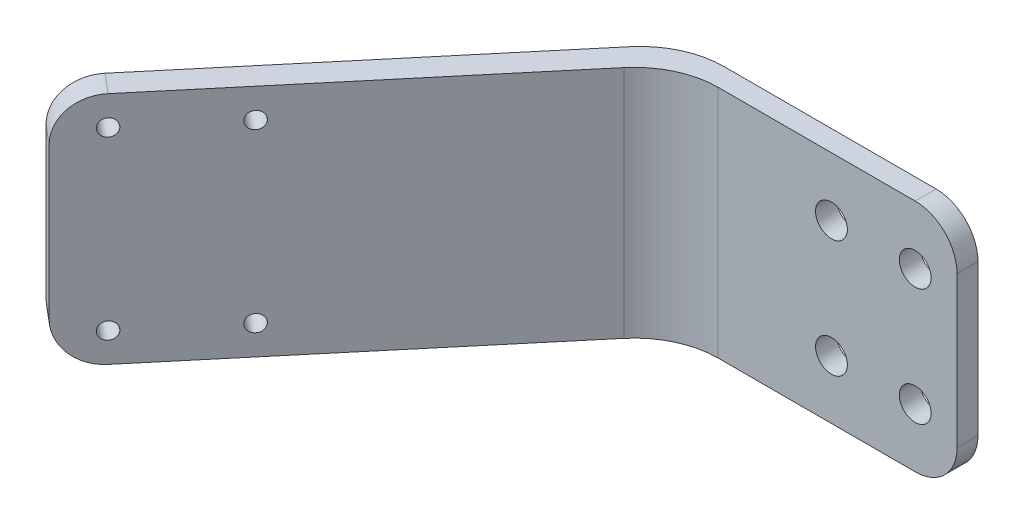
ISO-10303-21;
HEADER;
FILE_DESCRIPTION(('STEP AP214'),'2;1');
FILE_NAME('part.step','',(''),(''),'','','');
FILE_SCHEMA(('AUTOMOTIVE_DESIGN { 1 0 10303 214 1 1 1 1 }'));
ENDSEC;
DATA;
#1=APPLICATION_CONTEXT('core data for automotive mechanical design processes');
#2=APPLICATION_PROTOCOL_DEFINITION('international standard','automotive_design',2000,#1);
#3=PRODUCT_CONTEXT('',#1,'mechanical');
#4=PRODUCT('Part','Part','',(#3));
#5=PRODUCT_RELATED_PRODUCT_CATEGORY('part','',(#4));
#6=PRODUCT_DEFINITION_FORMATION('','',#4);
#7=PRODUCT_DEFINITION_CONTEXT('part definition',#1,'design');
#8=PRODUCT_DEFINITION('design','',#6,#7);
#9=PRODUCT_DEFINITION_SHAPE('','',#8);
#10=(LENGTH_UNIT() NAMED_UNIT(*) SI_UNIT(.MILLI.,.METRE.));
#11=(NAMED_UNIT(*) PLANE_ANGLE_UNIT() SI_UNIT($,.RADIAN.));
#12=(NAMED_UNIT(*) SI_UNIT($,.STERADIAN.) SOLID_ANGLE_UNIT());
#13=UNCERTAINTY_MEASURE_WITH_UNIT(LENGTH_MEASURE(1.E-05),#10,'distance_accuracy_value','');
#14=(GEOMETRIC_REPRESENTATION_CONTEXT(3) GLOBAL_UNCERTAINTY_ASSIGNED_CONTEXT((#13)) GLOBAL_UNIT_ASSIGNED_CONTEXT((#10,
#11,#12)) REPRESENTATION_CONTEXT('',''));
#15=CARTESIAN_POINT('',(0.,0.,0.));
#16=DIRECTION('',(0.,0.,1.));
#17=DIRECTION('',(1.,0.,0.));
#18=AXIS2_PLACEMENT_3D('',#15,#16,#17);
#19=CARTESIAN_POINT('',(0.,0.,-2.5));
#20=DIRECTION('',(0.,0.,1.));
#21=DIRECTION('',(1.,0.,0.));
#22=AXIS2_PLACEMENT_3D('',#19,#20,#21);
#23=PLANE('',#22);
#24=CARTESIAN_POINT('',(-158.168511731156,42.1549400479616,-2.5));
#25=DIRECTION('',(0.,0.,1.));
#26=DIRECTION('',(1.,0.,0.));
#27=AXIS2_PLACEMENT_3D('',#24,#25,#26);
#28=CIRCLE('',#27,1.89999999999997);
#29=CARTESIAN_POINT('',(-156.268511731156,42.1549400479616,-2.5));
#30=VERTEX_POINT('',#29);
#31=EDGE_CURVE('E353',#30,#30,#28,.T.);
#32=ORIENTED_EDGE('',*,*,#31,.T.);
#33=EDGE_LOOP('',(#32));
#34=FACE_BOUND('',#33,.T.);
#35=CARTESIAN_POINT('',(-148.168511731156,56.1549400479616,-2.5));
#36=DIRECTION('',(0.,0.,1.));
#37=DIRECTION('',(1.,0.,0.));
#38=AXIS2_PLACEMENT_3D('',#35,#36,#37);
#39=CIRCLE('',#38,1.9);
#40=CARTESIAN_POINT('',(-146.268511731156,56.1549400479616,-2.5));
#41=VERTEX_POINT('',#40);
#42=EDGE_CURVE('E347',#41,#41,#39,.T.);
#43=ORIENTED_EDGE('',*,*,#42,.T.);
#44=EDGE_LOOP('',(#43));
#45=FACE_BOUND('',#44,.T.);
#46=DIRECTION('',(0.,1.,0.));
#47=VECTOR('',#46,1.);
#48=CARTESIAN_POINT('',(-143.168511731156,63.1549400479616,-2.5));
#49=LINE('',#48,#47);
#50=CARTESIAN_POINT('',(-143.168511731156,40.1549400479616,-2.5));
#51=VERTEX_POINT('',#50);
#52=CARTESIAN_POINT('',(-143.168511731156,58.1549400479616,-2.5));
#53=VERTEX_POINT('',#52);
#54=EDGE_CURVE('E220',#51,#53,#49,.T.);
#55=ORIENTED_EDGE('',*,*,#54,.F.);
#56=CARTESIAN_POINT('',(-148.168511731156,40.1549400479616,-2.5));
#57=DIRECTION('',(0.,0.,1.));
#58=DIRECTION('',(1.,0.,0.));
#59=AXIS2_PLACEMENT_3D('',#56,#57,#58);
#60=CIRCLE('',#59,5.);
#61=CARTESIAN_POINT('',(-148.168511731156,35.1549400479616,-2.5));
#62=VERTEX_POINT('',#61);
#63=EDGE_CURVE('E182',#51,#62,#60,.F.);
#64=ORIENTED_EDGE('',*,*,#63,.T.);
#65=DIRECTION('',(1.,0.,0.));
#66=VECTOR('',#65,1.);
#67=CARTESIAN_POINT('',(-178.168511731156,35.1549400479616,-2.5));
#68=LINE('',#67,#66);
#69=CARTESIAN_POINT('',(-173.505435149606,35.1549400479616,-2.5));
#70=VERTEX_POINT('',#69);
#71=EDGE_CURVE('E146',#70,#62,#68,.T.);
#72=ORIENTED_EDGE('',*,*,#71,.F.);
#73=DIRECTION('',(0.,-1.,0.));
#74=VECTOR('',#73,1.);
#75=CARTESIAN_POINT('',(-173.505435149606,63.1549400479616,-2.5));
#76=LINE('',#75,#74);
#77=CARTESIAN_POINT('',(-173.505435149606,63.1549400479616,-2.5));
#78=VERTEX_POINT('',#77);
#79=EDGE_CURVE('E141',#70,#78,#76,.F.);
#80=ORIENTED_EDGE('',*,*,#79,.T.);
#81=DIRECTION('',(-1.,0.,0.));
#82=VECTOR('',#81,1.);
#83=CARTESIAN_POINT('',(-178.168511731156,63.1549400479616,-2.5));
#84=LINE('',#83,#82);
#85=CARTESIAN_POINT('',(-148.168511731156,63.1549400479616,-2.5));
#86=VERTEX_POINT('',#85);
#87=EDGE_CURVE('E136',#86,#78,#84,.T.);
#88=ORIENTED_EDGE('',*,*,#87,.F.);
#89=CARTESIAN_POINT('',(-148.168511731156,58.1549400479616,-2.5));
#90=DIRECTION('',(0.,0.,1.));
#91=DIRECTION('',(1.,0.,0.));
#92=AXIS2_PLACEMENT_3D('',#89,#90,#91);
#93=CIRCLE('',#92,5.);
#94=EDGE_CURVE('E180',#86,#53,#93,.F.);
#95=ORIENTED_EDGE('',*,*,#94,.T.);
#96=EDGE_LOOP('',(#55,#64,#72,#80,#88,#95));
#97=FACE_BOUND('',#96,.T.);
#98=CARTESIAN_POINT('',(-158.168511731156,56.1549400479616,-2.5));
#99=DIRECTION('',(0.,0.,1.));
#100=DIRECTION('',(1.,0.,0.));
#101=AXIS2_PLACEMENT_3D('',#98,#99,#100);
#102=CIRCLE('',#101,1.9);
#103=CARTESIAN_POINT('',(-156.268511731156,56.1549400479616,-2.5));
#104=VERTEX_POINT('',#103);
#105=EDGE_CURVE('E350',#104,#104,#102,.F.);
#106=ORIENTED_EDGE('',*,*,#105,.F.);
#107=EDGE_LOOP('',(#106));
#108=FACE_BOUND('',#107,.T.);
#109=CARTESIAN_POINT('',(-148.168511731156,42.1549400479616,-2.5));
#110=DIRECTION('',(0.,0.,1.));
#111=DIRECTION('',(1.,0.,0.));
#112=AXIS2_PLACEMENT_3D('',#109,#110,#111);
#113=CIRCLE('',#112,1.9);
#114=CARTESIAN_POINT('',(-146.268511731156,42.1549400479616,-2.5));
#115=VERTEX_POINT('',#114);
#116=EDGE_CURVE('E355',#115,#115,#113,.F.);
#117=ORIENTED_EDGE('',*,*,#116,.F.);
#118=EDGE_LOOP('',(#117));
#119=FACE_BOUND('',#118,.T.);
#120=ADVANCED_FACE('F33',(#34,#45,#97,#108,#119),#23,.F.);
#121=CARTESIAN_POINT('',(0.,0.,0.));
#122=DIRECTION('',(0.,0.,1.));
#123=DIRECTION('',(1.,0.,0.));
#124=AXIS2_PLACEMENT_3D('',#121,#122,#123);
#125=PLANE('',#124);
#126=CARTESIAN_POINT('',(-158.168511731156,56.1549400479616,0.));
#127=DIRECTION('',(0.,0.,1.));
#128=DIRECTION('',(1.,0.,0.));
#129=AXIS2_PLACEMENT_3D('',#126,#127,#128);
#130=CIRCLE('',#129,1.9);
#131=CARTESIAN_POINT('',(-156.268511731156,56.1549400479616,0.));
#132=VERTEX_POINT('',#131);
#133=EDGE_CURVE('E340',#132,#132,#130,.F.);
#134=ORIENTED_EDGE('',*,*,#133,.T.);
#135=EDGE_LOOP('',(#134));
#136=FACE_BOUND('',#135,.T.);
#137=CARTESIAN_POINT('',(-148.168511731156,56.1549400479616,0.));
#138=DIRECTION('',(0.,0.,1.));
#139=DIRECTION('',(1.,0.,0.));
#140=AXIS2_PLACEMENT_3D('',#137,#138,#139);
#141=CIRCLE('',#140,1.9);
#142=CARTESIAN_POINT('',(-146.268511731156,56.1549400479616,0.));
#143=VERTEX_POINT('',#142);
#144=EDGE_CURVE('E344',#143,#143,#141,.T.);
#145=ORIENTED_EDGE('',*,*,#144,.F.);
#146=EDGE_LOOP('',(#145));
#147=FACE_BOUND('',#146,.T.);
#148=DIRECTION('',(1.,0.,0.));
#149=VECTOR('',#148,1.);
#150=CARTESIAN_POINT('',(-178.168511731156,35.1549400479616,0.));
#151=LINE('',#150,#149);
#152=CARTESIAN_POINT('',(-171.686962359552,35.1549400479616,0.));
#153=VERTEX_POINT('',#152);
#154=CARTESIAN_POINT('',(-148.168511731156,35.1549400479616,0.));
#155=VERTEX_POINT('',#154);
#156=EDGE_CURVE('E223',#153,#155,#151,.T.);
#157=ORIENTED_EDGE('',*,*,#156,.T.);
#158=CARTESIAN_POINT('',(-148.168511731156,40.1549400479616,0.));
#159=DIRECTION('',(0.,0.,1.));
#160=DIRECTION('',(1.,0.,0.));
#161=AXIS2_PLACEMENT_3D('',#158,#159,#160);
#162=CIRCLE('',#161,5.);
#163=CARTESIAN_POINT('',(-143.168511731156,40.1549400479616,0.));
#164=VERTEX_POINT('',#163);
#165=EDGE_CURVE('E173',#155,#164,#162,.T.);
#166=ORIENTED_EDGE('',*,*,#165,.T.);
#167=DIRECTION('',(0.,1.,0.));
#168=VECTOR('',#167,1.);
#169=CARTESIAN_POINT('',(-143.168511731156,63.1549400479616,0.));
#170=LINE('',#169,#168);
#171=CARTESIAN_POINT('',(-143.168511731156,58.1549400479616,0.));
#172=VERTEX_POINT('',#171);
#173=EDGE_CURVE('E128',#164,#172,#170,.T.);
#174=ORIENTED_EDGE('',*,*,#173,.T.);
#175=CARTESIAN_POINT('',(-148.168511731156,58.1549400479616,0.));
#176=DIRECTION('',(0.,0.,1.));
#177=DIRECTION('',(1.,0.,0.));
#178=AXIS2_PLACEMENT_3D('',#175,#176,#177);
#179=CIRCLE('',#178,5.);
#180=CARTESIAN_POINT('',(-148.168511731156,63.1549400479616,0.));
#181=VERTEX_POINT('',#180);
#182=EDGE_CURVE('E171',#172,#181,#179,.T.);
#183=ORIENTED_EDGE('',*,*,#182,.T.);
#184=DIRECTION('',(-1.,0.,0.));
#185=VECTOR('',#184,1.);
#186=CARTESIAN_POINT('',(-178.168511731156,63.1549400479616,0.));
#187=LINE('',#186,#185);
#188=CARTESIAN_POINT('',(-171.686962359552,63.1549400479616,0.));
#189=VERTEX_POINT('',#188);
#190=EDGE_CURVE('E227',#181,#189,#187,.T.);
#191=ORIENTED_EDGE('',*,*,#190,.T.);
#192=DIRECTION('',(0.,1.,0.));
#193=VECTOR('',#192,1.);
#194=CARTESIAN_POINT('',(-171.686962359552,35.1549400479616,0.));
#195=LINE('',#194,#193);
#196=EDGE_CURVE('E158',#189,#153,#195,.F.);
#197=ORIENTED_EDGE('',*,*,#196,.T.);
#198=EDGE_LOOP('',(#157,#166,#174,#183,#191,#197));
#199=FACE_BOUND('',#198,.T.);
#200=CARTESIAN_POINT('',(-158.168511731156,42.1549400479616,0.));
#201=DIRECTION('',(0.,0.,1.));
#202=DIRECTION('',(1.,0.,0.));
#203=AXIS2_PLACEMENT_3D('',#200,#201,#202);
#204=CIRCLE('',#203,1.89999999999997);
#205=CARTESIAN_POINT('',(-156.268511731156,42.1549400479616,0.));
#206=VERTEX_POINT('',#205);
#207=EDGE_CURVE('E334',#206,#206,#204,.T.);
#208=ORIENTED_EDGE('',*,*,#207,.F.);
#209=EDGE_LOOP('',(#208));
#210=FACE_BOUND('',#209,.T.);
#211=CARTESIAN_POINT('',(-148.168511731156,42.1549400479616,0.));
#212=DIRECTION('',(0.,0.,1.));
#213=DIRECTION('',(1.,0.,0.));
#214=AXIS2_PLACEMENT_3D('',#211,#212,#213);
#215=CIRCLE('',#214,1.9);
#216=CARTESIAN_POINT('',(-146.268511731156,42.1549400479616,0.));
#217=VERTEX_POINT('',#216);
#218=EDGE_CURVE('E337',#217,#217,#215,.F.);
#219=ORIENTED_EDGE('',*,*,#218,.T.);
#220=EDGE_LOOP('',(#219));
#221=FACE_BOUND('',#220,.T.);
#222=ADVANCED_FACE('F285',(#136,#147,#199,#210,#221),#125,.T.);
#223=CARTESIAN_POINT('',(-143.168511731156,63.1549400479616,-2.5));
#224=DIRECTION('',(1.,0.,0.));
#225=DIRECTION('',(0.,1.,0.));
#226=AXIS2_PLACEMENT_3D('',#223,#224,#225);
#227=PLANE('',#226);
#228=ORIENTED_EDGE('',*,*,#173,.F.);
#229=DIRECTION('',(0.,0.,1.));
#230=VECTOR('',#229,1.);
#231=CARTESIAN_POINT('',(-143.168511731156,40.1549400479616,-2.5));
#232=LINE('',#231,#230);
#233=EDGE_CURVE('E178',#164,#51,#232,.F.);
#234=ORIENTED_EDGE('',*,*,#233,.T.);
#235=ORIENTED_EDGE('',*,*,#54,.T.);
#236=DIRECTION('',(0.,0.,1.));
#237=VECTOR('',#236,1.);
#238=CARTESIAN_POINT('',(-143.168511731156,58.1549400479616,-2.5));
#239=LINE('',#238,#237);
#240=EDGE_CURVE('E175',#53,#172,#239,.T.);
#241=ORIENTED_EDGE('',*,*,#240,.T.);
#242=EDGE_LOOP('',(#228,#234,#235,#241));
#243=FACE_BOUND('',#242,.T.);
#244=ADVANCED_FACE('F291',(#243),#227,.T.);
#245=CARTESIAN_POINT('',(-178.168511731156,35.1549400479616,-2.5));
#246=DIRECTION('',(0.,-1.,0.));
#247=DIRECTION('',(0.,0.,-1.));
#248=AXIS2_PLACEMENT_3D('',#245,#246,#247);
#249=PLANE('',#248);
#250=ORIENTED_EDGE('',*,*,#71,.T.);
#251=DIRECTION('',(0.,0.,1.));
#252=VECTOR('',#251,1.);
#253=CARTESIAN_POINT('',(-148.168511731156,35.1549400479616,-2.5));
#254=LINE('',#253,#252);
#255=EDGE_CURVE('E168',#62,#155,#254,.T.);
#256=ORIENTED_EDGE('',*,*,#255,.T.);
#257=ORIENTED_EDGE('',*,*,#156,.F.);
#258=CARTESIAN_POINT('',(-171.686962359552,35.1549400479616,10.));
#259=DIRECTION('',(0.,-1.,0.));
#260=DIRECTION('',(0.,0.,-1.));
#261=AXIS2_PLACEMENT_3D('',#258,#259,#260);
#262=CIRCLE('',#261,10.);
#263=CARTESIAN_POINT('',(-179.347406790742,35.1549400479616,3.57212390313457));
#264=VERTEX_POINT('',#263);
#265=EDGE_CURVE('E163',#153,#264,#262,.F.);
#266=ORIENTED_EDGE('',*,*,#265,.T.);
#267=DIRECTION('',(-0.642787609686543,0.,0.766044443118975));
#268=VECTOR('',#267,1.);
#269=CARTESIAN_POINT('',(-175.30116440213,35.1549400479616,-1.25));
#270=LINE('',#269,#268);
#271=CARTESIAN_POINT('',(-207.461946852968,35.1549400479616,37.0777280264257));
#272=VERTEX_POINT('',#271);
#273=EDGE_CURVE('E200',#264,#272,#270,.T.);
#274=ORIENTED_EDGE('',*,*,#273,.T.);
#275=DIRECTION('',(-0.766044443118976,0.,-0.642787609686542));
#276=VECTOR('',#275,1.);
#277=CARTESIAN_POINT('',(-209.760080182325,35.1549400479616,35.1493651973661));
#278=LINE('',#277,#276);
#279=CARTESIAN_POINT('',(-209.760080182325,35.1549400479616,35.1493651973661));
#280=VERTEX_POINT('',#279);
#281=EDGE_CURVE('E165',#272,#280,#278,.T.);
#282=ORIENTED_EDGE('',*,*,#281,.T.);
#283=DIRECTION('',(0.642787609686543,0.,-0.766044443118975));
#284=VECTOR('',#283,1.);
#285=CARTESIAN_POINT('',(-178.168511731156,35.1549400479616,-2.5));
#286=LINE('',#285,#284);
#287=CARTESIAN_POINT('',(-181.165879580795,35.1549400479616,1.07212390313458));
#288=VERTEX_POINT('',#287);
#289=EDGE_CURVE('E211',#280,#288,#286,.T.);
#290=ORIENTED_EDGE('',*,*,#289,.T.);
#291=CARTESIAN_POINT('',(-173.505435149606,35.1549400479616,7.5));
#292=DIRECTION('',(0.,-1.,0.));
#293=DIRECTION('',(0.,0.,-1.));
#294=AXIS2_PLACEMENT_3D('',#291,#292,#293);
#295=CIRCLE('',#294,10.);
#296=EDGE_CURVE('E145',#288,#70,#295,.T.);
#297=ORIENTED_EDGE('',*,*,#296,.T.);
#298=EDGE_LOOP('',(#250,#256,#257,#266,#274,#282,#290,#297));
#299=FACE_BOUND('',#298,.T.);
#300=ADVANCED_FACE('F208',(#299),#249,.T.);
#301=CARTESIAN_POINT('',(-178.168511731156,63.1549400479616,-2.5));
#302=DIRECTION('',(0.,1.,0.));
#303=DIRECTION('',(0.,0.,1.));
#304=AXIS2_PLACEMENT_3D('',#301,#302,#303);
#305=PLANE('',#304);
#306=ORIENTED_EDGE('',*,*,#190,.F.);
#307=DIRECTION('',(0.,0.,1.));
#308=VECTOR('',#307,1.);
#309=CARTESIAN_POINT('',(-148.168511731156,63.1549400479616,-2.5));
#310=LINE('',#309,#308);
#311=EDGE_CURVE('E186',#181,#86,#310,.F.);
#312=ORIENTED_EDGE('',*,*,#311,.T.);
#313=ORIENTED_EDGE('',*,*,#87,.T.);
#314=CARTESIAN_POINT('',(-173.505435149606,63.1549400479616,7.5));
#315=DIRECTION('',(0.,1.,0.));
#316=DIRECTION('',(0.,0.,1.));
#317=AXIS2_PLACEMENT_3D('',#314,#315,#316);
#318=CIRCLE('',#317,10.);
#319=CARTESIAN_POINT('',(-181.165879580795,63.1549400479616,1.07212390313459));
#320=VERTEX_POINT('',#319);
#321=EDGE_CURVE('E132',#78,#320,#318,.T.);
#322=ORIENTED_EDGE('',*,*,#321,.T.);
#323=DIRECTION('',(0.642787609686543,0.,-0.766044443118975));
#324=VECTOR('',#323,1.);
#325=CARTESIAN_POINT('',(-178.168511731156,63.1549400479616,-2.5));
#326=LINE('',#325,#324);
#327=CARTESIAN_POINT('',(-209.760080182325,63.1549400479616,35.1493651973662));
#328=VERTEX_POINT('',#327);
#329=EDGE_CURVE('E122',#328,#320,#326,.T.);
#330=ORIENTED_EDGE('',*,*,#329,.F.);
#331=DIRECTION('',(-0.766044443118976,0.,-0.642787609686542));
#332=VECTOR('',#331,1.);
#333=CARTESIAN_POINT('',(-209.760080182325,63.1549400479616,35.1493651973662));
#334=LINE('',#333,#332);
#335=CARTESIAN_POINT('',(-207.461946852968,63.1549400479616,37.0777280264258));
#336=VERTEX_POINT('',#335);
#337=EDGE_CURVE('E184',#328,#336,#334,.F.);
#338=ORIENTED_EDGE('',*,*,#337,.T.);
#339=DIRECTION('',(-0.642787609686543,0.,0.766044443118975));
#340=VECTOR('',#339,1.);
#341=CARTESIAN_POINT('',(-175.30116440213,63.1549400479616,-1.25));
#342=LINE('',#341,#340);
#343=CARTESIAN_POINT('',(-179.347406790742,63.1549400479616,3.57212390313457));
#344=VERTEX_POINT('',#343);
#345=EDGE_CURVE('E216',#344,#336,#342,.T.);
#346=ORIENTED_EDGE('',*,*,#345,.F.);
#347=CARTESIAN_POINT('',(-171.686962359552,63.1549400479616,10.));
#348=DIRECTION('',(0.,1.,0.));
#349=DIRECTION('',(0.,0.,1.));
#350=AXIS2_PLACEMENT_3D('',#347,#348,#349);
#351=CIRCLE('',#350,10.);
#352=EDGE_CURVE('E160',#344,#189,#351,.F.);
#353=ORIENTED_EDGE('',*,*,#352,.T.);
#354=EDGE_LOOP('',(#306,#312,#313,#322,#330,#338,#346,#353));
#355=FACE_BOUND('',#354,.T.);
#356=ADVANCED_FACE('F134',(#355),#305,.T.);
#357=CARTESIAN_POINT('',(-175.30116440213,145.356271435474,-1.25));
#358=DIRECTION('',(0.766044443118975,0.,0.642787609686543));
#359=DIRECTION('',(0.642787609686543,0.,-0.766044443118975));
#360=AXIS2_PLACEMENT_3D('',#357,#358,#359);
#361=PLANE('',#360);
#362=CARTESIAN_POINT('',(-199.427101731886,38.6549400479616,27.5021724874385));
#363=DIRECTION('',(0.766044443118975,0.,0.642787609686543));
#364=DIRECTION('',(0.642787609686543,0.,-0.766044443118975));
#365=AXIS2_PLACEMENT_3D('',#362,#363,#364);
#366=CIRCLE('',#365,1.);
#367=CARTESIAN_POINT('',(-198.784314122199,38.6549400479616,26.7361280443195));
#368=VERTEX_POINT('',#367);
#369=EDGE_CURVE('E270',#368,#368,#366,.T.);
#370=ORIENTED_EDGE('',*,*,#369,.F.);
#371=EDGE_LOOP('',(#370));
#372=FACE_BOUND('',#371,.T.);
#373=CARTESIAN_POINT('',(-199.427101731886,59.6549400479616,27.5021724874385));
#374=DIRECTION('',(0.766044443118975,0.,0.642787609686543));
#375=DIRECTION('',(0.642787609686543,0.,-0.766044443118975));
#376=AXIS2_PLACEMENT_3D('',#373,#374,#375);
#377=CIRCLE('',#376,1.);
#378=CARTESIAN_POINT('',(-198.784314122199,59.6549400479616,26.7361280443195));
#379=VERTEX_POINT('',#378);
#380=EDGE_CURVE('E266',#379,#379,#377,.T.);
#381=ORIENTED_EDGE('',*,*,#380,.F.);
#382=EDGE_LOOP('',(#381));
#383=FACE_BOUND('',#382,.T.);
#384=CARTESIAN_POINT('',(-207.461946852968,59.6549400479616,37.0777280264257));
#385=DIRECTION('',(0.766044443118975,0.,0.642787609686543));
#386=DIRECTION('',(0.642787609686543,0.,-0.766044443118975));
#387=AXIS2_PLACEMENT_3D('',#384,#385,#386);
#388=CIRCLE('',#387,1.);
#389=CARTESIAN_POINT('',(-206.819159243281,59.6549400479616,36.3116835833067));
#390=VERTEX_POINT('',#389);
#391=EDGE_CURVE('E263',#390,#390,#388,.T.);
#392=ORIENTED_EDGE('',*,*,#391,.F.);
#393=EDGE_LOOP('',(#392));
#394=FACE_BOUND('',#393,.T.);
#395=CARTESIAN_POINT('',(-207.461946852968,38.6549400479616,37.0777280264257));
#396=DIRECTION('',(0.766044443118975,0.,0.642787609686543));
#397=DIRECTION('',(0.642787609686543,0.,-0.766044443118975));
#398=AXIS2_PLACEMENT_3D('',#395,#396,#397);
#399=CIRCLE('',#398,1.);
#400=CARTESIAN_POINT('',(-206.819159243281,38.6549400479616,36.3116835833067));
#401=VERTEX_POINT('',#400);
#402=EDGE_CURVE('E235',#401,#401,#399,.T.);
#403=ORIENTED_EDGE('',*,*,#402,.F.);
#404=EDGE_LOOP('',(#403));
#405=FACE_BOUND('',#404,.T.);
#406=ORIENTED_EDGE('',*,*,#345,.T.);
#407=CARTESIAN_POINT('',(-207.461946852968,58.1549400479616,37.0777280264258));
#408=DIRECTION('',(0.766044443118975,0.,0.642787609686543));
#409=DIRECTION('',(0.642787609686543,0.,-0.766044443118975));
#410=AXIS2_PLACEMENT_3D('',#407,#408,#409);
#411=CIRCLE('',#410,5.);
#412=CARTESIAN_POINT('',(-210.6758849014,58.1549400479617,40.9079502420206));
#413=VERTEX_POINT('',#412);
#414=EDGE_CURVE('E11',#336,#413,#411,.T.);
#415=ORIENTED_EDGE('',*,*,#414,.T.);
#416=DIRECTION('',(0.,-1.,0.));
#417=VECTOR('',#416,1.);
#418=CARTESIAN_POINT('',(-210.6758849014,145.356271435474,40.9079502420206));
#419=LINE('',#418,#417);
#420=CARTESIAN_POINT('',(-210.6758849014,40.1549400479616,40.9079502420206));
#421=VERTEX_POINT('',#420);
#422=EDGE_CURVE('E203',#413,#421,#419,.T.);
#423=ORIENTED_EDGE('',*,*,#422,.T.);
#424=CARTESIAN_POINT('',(-207.461946852968,40.1549400479616,37.0777280264258));
#425=DIRECTION('',(0.766044443118975,0.,0.642787609686543));
#426=DIRECTION('',(0.642787609686543,0.,-0.766044443118975));
#427=AXIS2_PLACEMENT_3D('',#424,#425,#426);
#428=CIRCLE('',#427,5.);
#429=EDGE_CURVE('E41',#421,#272,#428,.T.);
#430=ORIENTED_EDGE('',*,*,#429,.T.);
#431=ORIENTED_EDGE('',*,*,#273,.F.);
#432=DIRECTION('',(0.,1.,0.));
#433=VECTOR('',#432,1.);
#434=CARTESIAN_POINT('',(-179.347406790742,63.1549400479616,3.57212390313457));
#435=LINE('',#434,#433);
#436=EDGE_CURVE('E140',#264,#344,#435,.T.);
#437=ORIENTED_EDGE('',*,*,#436,.T.);
#438=EDGE_LOOP('',(#406,#415,#423,#430,#431,#437));
#439=FACE_BOUND('',#438,.T.);
#440=ADVANCED_FACE('F199',(#372,#383,#394,#405,#439),#361,.T.);
#441=CARTESIAN_POINT('',(-212.974018230757,145.356271435474,38.979587412961));
#442=DIRECTION('',(-0.642787609686542,0.,0.766044443118976));
#443=DIRECTION('',(0.766044443118976,0.,0.642787609686542));
#444=AXIS2_PLACEMENT_3D('',#441,#442,#443);
#445=PLANE('',#444);
#446=ORIENTED_EDGE('',*,*,#422,.F.);
#447=DIRECTION('',(-0.766044443118976,0.,-0.642787609686542));
#448=VECTOR('',#447,1.);
#449=CARTESIAN_POINT('',(-212.974018230757,58.1549400479616,38.979587412961));
#450=LINE('',#449,#448);
#451=CARTESIAN_POINT('',(-212.974018230757,58.1549400479617,38.979587412961));
#452=VERTEX_POINT('',#451);
#453=EDGE_CURVE('E190',#413,#452,#450,.T.);
#454=ORIENTED_EDGE('',*,*,#453,.T.);
#455=DIRECTION('',(0.,-1.,0.));
#456=VECTOR('',#455,1.);
#457=CARTESIAN_POINT('',(-212.974018230757,145.356271435474,38.979587412961));
#458=LINE('',#457,#456);
#459=CARTESIAN_POINT('',(-212.974018230757,40.1549400479616,38.979587412961));
#460=VERTEX_POINT('',#459);
#461=EDGE_CURVE('E129',#452,#460,#458,.T.);
#462=ORIENTED_EDGE('',*,*,#461,.T.);
#463=DIRECTION('',(-0.766044443118976,0.,-0.642787609686542));
#464=VECTOR('',#463,1.);
#465=CARTESIAN_POINT('',(-212.974018230757,40.1549400479616,38.979587412961));
#466=LINE('',#465,#464);
#467=EDGE_CURVE('E188',#460,#421,#466,.F.);
#468=ORIENTED_EDGE('',*,*,#467,.T.);
#469=EDGE_LOOP('',(#446,#454,#462,#468));
#470=FACE_BOUND('',#469,.T.);
#471=ADVANCED_FACE('F214',(#470),#445,.T.);
#472=CARTESIAN_POINT('',(-178.168511731156,145.356271435474,-2.5));
#473=DIRECTION('',(-0.766044443118975,0.,-0.642787609686543));
#474=DIRECTION('',(-0.642787609686543,0.,0.766044443118975));
#475=AXIS2_PLACEMENT_3D('',#472,#473,#474);
#476=PLANE('',#475);
#477=CARTESIAN_POINT('',(-201.725235061243,38.6549400479616,25.5738096583789));
#478=DIRECTION('',(-0.766044443118975,0.,-0.642787609686543));
#479=DIRECTION('',(-0.642787609686543,0.,0.766044443118975));
#480=AXIS2_PLACEMENT_3D('',#477,#478,#479);
#481=CIRCLE('',#480,1.);
#482=CARTESIAN_POINT('',(-202.368022670929,38.6549400479616,26.3398541014979));
#483=VERTEX_POINT('',#482);
#484=EDGE_CURVE('E152',#483,#483,#481,.T.);
#485=ORIENTED_EDGE('',*,*,#484,.F.);
#486=EDGE_LOOP('',(#485));
#487=FACE_BOUND('',#486,.T.);
#488=CARTESIAN_POINT('',(-201.725235061243,59.6549400479616,25.5738096583789));
#489=DIRECTION('',(-0.766044443118975,0.,-0.642787609686543));
#490=DIRECTION('',(-0.642787609686543,0.,0.766044443118975));
#491=AXIS2_PLACEMENT_3D('',#488,#489,#490);
#492=CIRCLE('',#491,1.);
#493=CARTESIAN_POINT('',(-202.368022670929,59.6549400479616,26.3398541014979));
#494=VERTEX_POINT('',#493);
#495=EDGE_CURVE('E237',#494,#494,#492,.T.);
#496=ORIENTED_EDGE('',*,*,#495,.F.);
#497=EDGE_LOOP('',(#496));
#498=FACE_BOUND('',#497,.T.);
#499=CARTESIAN_POINT('',(-209.760080182325,59.6549400479616,35.1493651973661));
#500=DIRECTION('',(-0.766044443118975,0.,-0.642787609686543));
#501=DIRECTION('',(-0.642787609686543,0.,0.766044443118975));
#502=AXIS2_PLACEMENT_3D('',#499,#500,#501);
#503=CIRCLE('',#502,1.);
#504=CARTESIAN_POINT('',(-210.402867792011,59.6549400479616,35.9154096404851));
#505=VERTEX_POINT('',#504);
#506=EDGE_CURVE('E234',#505,#505,#503,.T.);
#507=ORIENTED_EDGE('',*,*,#506,.F.);
#508=EDGE_LOOP('',(#507));
#509=FACE_BOUND('',#508,.T.);
#510=CARTESIAN_POINT('',(-209.760080182325,38.6549400479616,35.1493651973661));
#511=DIRECTION('',(-0.766044443118975,0.,-0.642787609686543));
#512=DIRECTION('',(-0.642787609686543,0.,0.766044443118975));
#513=AXIS2_PLACEMENT_3D('',#510,#511,#512);
#514=CIRCLE('',#513,1.);
#515=CARTESIAN_POINT('',(-210.402867792011,38.6549400479616,35.9154096404851));
#516=VERTEX_POINT('',#515);
#517=EDGE_CURVE('E231',#516,#516,#514,.T.);
#518=ORIENTED_EDGE('',*,*,#517,.F.);
#519=EDGE_LOOP('',(#518));
#520=FACE_BOUND('',#519,.T.);
#521=ORIENTED_EDGE('',*,*,#461,.F.);
#522=CARTESIAN_POINT('',(-209.760080182325,58.1549400479616,35.1493651973661));
#523=DIRECTION('',(-0.766044443118975,0.,-0.642787609686543));
#524=DIRECTION('',(-0.642787609686543,0.,0.766044443118975));
#525=AXIS2_PLACEMENT_3D('',#522,#523,#524);
#526=CIRCLE('',#525,5.);
#527=EDGE_CURVE('E56',#452,#328,#526,.T.);
#528=ORIENTED_EDGE('',*,*,#527,.T.);
#529=ORIENTED_EDGE('',*,*,#329,.T.);
#530=DIRECTION('',(0.,-1.,0.));
#531=VECTOR('',#530,1.);
#532=CARTESIAN_POINT('',(-181.165879580795,35.1549400479616,1.07212390313458));
#533=LINE('',#532,#531);
#534=EDGE_CURVE('E126',#320,#288,#533,.T.);
#535=ORIENTED_EDGE('',*,*,#534,.T.);
#536=ORIENTED_EDGE('',*,*,#289,.F.);
#537=CARTESIAN_POINT('',(-209.760080182325,40.1549400479616,35.1493651973661));
#538=DIRECTION('',(-0.766044443118975,0.,-0.642787609686543));
#539=DIRECTION('',(-0.642787609686543,0.,0.766044443118975));
#540=AXIS2_PLACEMENT_3D('',#537,#538,#539);
#541=CIRCLE('',#540,5.);
#542=EDGE_CURVE('E48',#280,#460,#541,.T.);
#543=ORIENTED_EDGE('',*,*,#542,.T.);
#544=EDGE_LOOP('',(#521,#528,#529,#535,#536,#543));
#545=FACE_BOUND('',#544,.T.);
#546=ADVANCED_FACE('F124',(#487,#498,#509,#520,#545),#476,.T.);
#547=CARTESIAN_POINT('',(-215.122391284157,38.6549400479616,30.6498519295603));
#548=DIRECTION('',(0.766044443118975,0.,0.642787609686543));
#549=DIRECTION('',(0.642787609686543,0.,-0.766044443118975));
#550=AXIS2_PLACEMENT_3D('',#547,#548,#549);
#551=CYLINDRICAL_SURFACE('',#550,1.);
#552=ORIENTED_EDGE('',*,*,#517,.T.);
#553=EDGE_LOOP('',(#552));
#554=FACE_BOUND('',#553,.T.);
#555=ORIENTED_EDGE('',*,*,#402,.T.);
#556=EDGE_LOOP('',(#555));
#557=FACE_BOUND('',#556,.T.);
#558=ADVANCED_FACE('F249',(#554,#557),#551,.F.);
#559=CARTESIAN_POINT('',(-215.122391284157,59.6549400479616,30.6498519295603));
#560=DIRECTION('',(0.766044443118975,0.,0.642787609686543));
#561=DIRECTION('',(0.642787609686543,0.,-0.766044443118975));
#562=AXIS2_PLACEMENT_3D('',#559,#560,#561);
#563=CYLINDRICAL_SURFACE('',#562,1.);
#564=ORIENTED_EDGE('',*,*,#506,.T.);
#565=EDGE_LOOP('',(#564));
#566=FACE_BOUND('',#565,.T.);
#567=ORIENTED_EDGE('',*,*,#391,.T.);
#568=EDGE_LOOP('',(#567));
#569=FACE_BOUND('',#568,.T.);
#570=ADVANCED_FACE('F258',(#566,#569),#563,.F.);
#571=CARTESIAN_POINT('',(-207.087546163076,59.6549400479616,21.0742963905731));
#572=DIRECTION('',(0.766044443118975,0.,0.642787609686543));
#573=DIRECTION('',(0.642787609686543,0.,-0.766044443118975));
#574=AXIS2_PLACEMENT_3D('',#571,#572,#573);
#575=CYLINDRICAL_SURFACE('',#574,1.);
#576=ORIENTED_EDGE('',*,*,#495,.T.);
#577=EDGE_LOOP('',(#576));
#578=FACE_BOUND('',#577,.T.);
#579=ORIENTED_EDGE('',*,*,#380,.T.);
#580=EDGE_LOOP('',(#579));
#581=FACE_BOUND('',#580,.T.);
#582=ADVANCED_FACE('F369',(#578,#581),#575,.F.);
#583=CARTESIAN_POINT('',(-207.087546163076,38.6549400479616,21.0742963905731));
#584=DIRECTION('',(0.766044443118975,0.,0.642787609686543));
#585=DIRECTION('',(0.642787609686543,0.,-0.766044443118975));
#586=AXIS2_PLACEMENT_3D('',#583,#584,#585);
#587=CYLINDRICAL_SURFACE('',#586,1.);
#588=ORIENTED_EDGE('',*,*,#484,.T.);
#589=EDGE_LOOP('',(#588));
#590=FACE_BOUND('',#589,.T.);
#591=ORIENTED_EDGE('',*,*,#369,.T.);
#592=EDGE_LOOP('',(#591));
#593=FACE_BOUND('',#592,.T.);
#594=ADVANCED_FACE('F244',(#590,#593),#587,.F.);
#595=CARTESIAN_POINT('',(-148.168511731156,56.1549400479616,-75.));
#596=DIRECTION('',(0.,0.,1.));
#597=DIRECTION('',(1.,0.,0.));
#598=AXIS2_PLACEMENT_3D('',#595,#596,#597);
#599=CYLINDRICAL_SURFACE('',#598,1.9);
#600=ORIENTED_EDGE('',*,*,#144,.T.);
#601=EDGE_LOOP('',(#600));
#602=FACE_BOUND('',#601,.T.);
#603=ORIENTED_EDGE('',*,*,#42,.F.);
#604=EDGE_LOOP('',(#603));
#605=FACE_BOUND('',#604,.T.);
#606=ADVANCED_FACE('F377',(#602,#605),#599,.F.);
#607=CARTESIAN_POINT('',(-158.168511731156,56.1549400479616,-75.));
#608=DIRECTION('',(0.,0.,1.));
#609=DIRECTION('',(1.,0.,0.));
#610=AXIS2_PLACEMENT_3D('',#607,#608,#609);
#611=CYLINDRICAL_SURFACE('',#610,1.9);
#612=ORIENTED_EDGE('',*,*,#133,.F.);
#613=EDGE_LOOP('',(#612));
#614=FACE_BOUND('',#613,.T.);
#615=ORIENTED_EDGE('',*,*,#105,.T.);
#616=EDGE_LOOP('',(#615));
#617=FACE_BOUND('',#616,.T.);
#618=ADVANCED_FACE('F420',(#614,#617),#611,.F.);
#619=CARTESIAN_POINT('',(-158.168511731156,42.1549400479616,-75.));
#620=DIRECTION('',(0.,0.,1.));
#621=DIRECTION('',(1.,0.,0.));
#622=AXIS2_PLACEMENT_3D('',#619,#620,#621);
#623=CYLINDRICAL_SURFACE('',#622,1.89999999999997);
#624=ORIENTED_EDGE('',*,*,#207,.T.);
#625=EDGE_LOOP('',(#624));
#626=FACE_BOUND('',#625,.T.);
#627=ORIENTED_EDGE('',*,*,#31,.F.);
#628=EDGE_LOOP('',(#627));
#629=FACE_BOUND('',#628,.T.);
#630=ADVANCED_FACE('F430',(#626,#629),#623,.F.);
#631=CARTESIAN_POINT('',(-148.168511731156,42.1549400479616,-75.));
#632=DIRECTION('',(0.,0.,1.));
#633=DIRECTION('',(1.,0.,0.));
#634=AXIS2_PLACEMENT_3D('',#631,#632,#633);
#635=CYLINDRICAL_SURFACE('',#634,1.9);
#636=ORIENTED_EDGE('',*,*,#218,.F.);
#637=EDGE_LOOP('',(#636));
#638=FACE_BOUND('',#637,.T.);
#639=ORIENTED_EDGE('',*,*,#116,.T.);
#640=EDGE_LOOP('',(#639));
#641=FACE_BOUND('',#640,.T.);
#642=ADVANCED_FACE('F309',(#638,#641),#635,.F.);
#643=CARTESIAN_POINT('',(-173.505435149606,145.356271435474,7.5));
#644=DIRECTION('',(0.,1.,0.));
#645=DIRECTION('',(0.,0.,1.));
#646=AXIS2_PLACEMENT_3D('',#643,#644,#645);
#647=CYLINDRICAL_SURFACE('',#646,10.);
#648=ORIENTED_EDGE('',*,*,#321,.F.);
#649=ORIENTED_EDGE('',*,*,#79,.F.);
#650=ORIENTED_EDGE('',*,*,#296,.F.);
#651=ORIENTED_EDGE('',*,*,#534,.F.);
#652=EDGE_LOOP('',(#648,#649,#650,#651));
#653=FACE_BOUND('',#652,.T.);
#654=ADVANCED_FACE('F144',(#653),#647,.T.);
#655=CARTESIAN_POINT('',(-171.686962359552,145.356271435474,10.));
#656=DIRECTION('',(0.,-1.,0.));
#657=DIRECTION('',(0.,0.,-1.));
#658=AXIS2_PLACEMENT_3D('',#655,#656,#657);
#659=CYLINDRICAL_SURFACE('',#658,10.);
#660=ORIENTED_EDGE('',*,*,#265,.F.);
#661=ORIENTED_EDGE('',*,*,#196,.F.);
#662=ORIENTED_EDGE('',*,*,#352,.F.);
#663=ORIENTED_EDGE('',*,*,#436,.F.);
#664=EDGE_LOOP('',(#660,#661,#662,#663));
#665=FACE_BOUND('',#664,.T.);
#666=ADVANCED_FACE('F308',(#665),#659,.F.);
#667=CARTESIAN_POINT('',(-148.168511731156,40.1549400479616,-2.5));
#668=DIRECTION('',(0.,0.,1.));
#669=DIRECTION('',(1.,0.,0.));
#670=AXIS2_PLACEMENT_3D('',#667,#668,#669);
#671=CYLINDRICAL_SURFACE('',#670,5.);
#672=ORIENTED_EDGE('',*,*,#63,.F.);
#673=ORIENTED_EDGE('',*,*,#233,.F.);
#674=ORIENTED_EDGE('',*,*,#165,.F.);
#675=ORIENTED_EDGE('',*,*,#255,.F.);
#676=EDGE_LOOP('',(#672,#673,#674,#675));
#677=FACE_BOUND('',#676,.T.);
#678=ADVANCED_FACE('F281',(#677),#671,.T.);
#679=CARTESIAN_POINT('',(-148.168511731156,58.1549400479616,-2.5));
#680=DIRECTION('',(0.,0.,1.));
#681=DIRECTION('',(1.,0.,0.));
#682=AXIS2_PLACEMENT_3D('',#679,#680,#681);
#683=CYLINDRICAL_SURFACE('',#682,5.);
#684=ORIENTED_EDGE('',*,*,#94,.F.);
#685=ORIENTED_EDGE('',*,*,#311,.F.);
#686=ORIENTED_EDGE('',*,*,#182,.F.);
#687=ORIENTED_EDGE('',*,*,#240,.F.);
#688=EDGE_LOOP('',(#684,#685,#686,#687));
#689=FACE_BOUND('',#688,.T.);
#690=ADVANCED_FACE('F276',(#689),#683,.T.);
#691=CARTESIAN_POINT('',(-209.760080182325,58.1549400479616,35.1493651973661));
#692=DIRECTION('',(-0.766044443118976,0.,-0.642787609686542));
#693=DIRECTION('',(-0.642787609686542,0.,0.766044443118976));
#694=AXIS2_PLACEMENT_3D('',#691,#692,#693);
#695=CYLINDRICAL_SURFACE('',#694,5.);
#696=ORIENTED_EDGE('',*,*,#414,.F.);
#697=ORIENTED_EDGE('',*,*,#337,.F.);
#698=ORIENTED_EDGE('',*,*,#527,.F.);
#699=ORIENTED_EDGE('',*,*,#453,.F.);
#700=EDGE_LOOP('',(#696,#697,#698,#699));
#701=FACE_BOUND('',#700,.T.);
#702=ADVANCED_FACE('F274',(#701),#695,.T.);
#703=CARTESIAN_POINT('',(-209.760080182325,40.1549400479616,35.1493651973662));
#704=DIRECTION('',(-0.766044443118976,0.,-0.642787609686542));
#705=DIRECTION('',(-0.642787609686542,0.,0.766044443118976));
#706=AXIS2_PLACEMENT_3D('',#703,#704,#705);
#707=CYLINDRICAL_SURFACE('',#706,5.);
#708=ORIENTED_EDGE('',*,*,#429,.F.);
#709=ORIENTED_EDGE('',*,*,#467,.F.);
#710=ORIENTED_EDGE('',*,*,#542,.F.);
#711=ORIENTED_EDGE('',*,*,#281,.F.);
#712=EDGE_LOOP('',(#708,#709,#710,#711));
#713=FACE_BOUND('',#712,.T.);
#714=ADVANCED_FACE('F35',(#713),#707,.T.);
#715=CLOSED_SHELL('',(#120,#222,#244,#300,#356,#440,#471,#546,#558,#570,#582,#594,#606,#618,
#630,#642,#654,#666,#678,#690,#702,#714));
#716=MANIFOLD_SOLID_BREP('B2',#715);
#717=ADVANCED_BREP_SHAPE_REPRESENTATION('',(#18,#716),#14);
#718=SHAPE_DEFINITION_REPRESENTATION(#9,#717);
ENDSEC;
END-ISO-10303-21;
